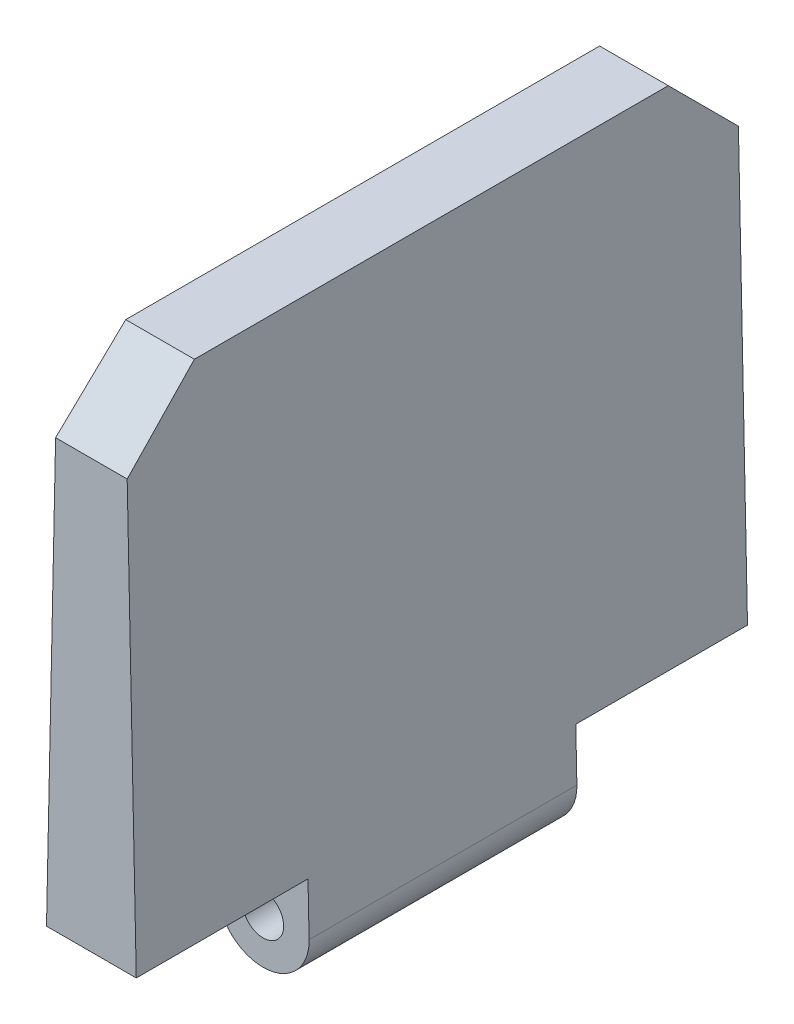
ISO-10303-21;
HEADER;
FILE_DESCRIPTION(('STEP AP214'),'2;1');
FILE_NAME('part.step','',(''),(''),'','','');
FILE_SCHEMA(('AUTOMOTIVE_DESIGN { 1 0 10303 214 1 1 1 1 }'));
ENDSEC;
DATA;
#1=APPLICATION_CONTEXT('core data for automotive mechanical design processes');
#2=APPLICATION_PROTOCOL_DEFINITION('international standard','automotive_design',2000,#1);
#3=PRODUCT_CONTEXT('',#1,'mechanical');
#4=PRODUCT('Part','Part','',(#3));
#5=PRODUCT_RELATED_PRODUCT_CATEGORY('part','',(#4));
#6=PRODUCT_DEFINITION_FORMATION('','',#4);
#7=PRODUCT_DEFINITION_CONTEXT('part definition',#1,'design');
#8=PRODUCT_DEFINITION('design','',#6,#7);
#9=PRODUCT_DEFINITION_SHAPE('','',#8);
#10=(LENGTH_UNIT() NAMED_UNIT(*) SI_UNIT(.MILLI.,.METRE.));
#11=(NAMED_UNIT(*) PLANE_ANGLE_UNIT() SI_UNIT($,.RADIAN.));
#12=(NAMED_UNIT(*) SI_UNIT($,.STERADIAN.) SOLID_ANGLE_UNIT());
#13=UNCERTAINTY_MEASURE_WITH_UNIT(LENGTH_MEASURE(1.E-05),#10,'distance_accuracy_value','');
#14=(GEOMETRIC_REPRESENTATION_CONTEXT(3) GLOBAL_UNCERTAINTY_ASSIGNED_CONTEXT((#13)) GLOBAL_UNIT_ASSIGNED_CONTEXT((#10,
#11,#12)) REPRESENTATION_CONTEXT('',''));
#15=CARTESIAN_POINT('',(0.,0.,0.));
#16=DIRECTION('',(0.,0.,1.));
#17=DIRECTION('',(1.,0.,0.));
#18=AXIS2_PLACEMENT_3D('',#15,#16,#17);
#19=CARTESIAN_POINT('',(1.27,20.32,-22.61));
#20=DIRECTION('',(0.,1.,0.));
#21=DIRECTION('',(0.,0.,1.));
#22=AXIS2_PLACEMENT_3D('',#19,#20,#21);
#23=PLANE('',#22);
#24=DIRECTION('',(0.,0.,1.));
#25=VECTOR('',#24,1.);
#26=CARTESIAN_POINT('',(1.27,20.32,-22.61));
#27=LINE('',#26,#25);
#28=CARTESIAN_POINT('',(1.27,20.32,-20.07));
#29=VERTEX_POINT('',#28);
#30=CARTESIAN_POINT('',(1.27,20.32,-2.53999999999999));
#31=VERTEX_POINT('',#30);
#32=EDGE_CURVE('E148',#29,#31,#27,.T.);
#33=ORIENTED_EDGE('',*,*,#32,.F.);
#34=DIRECTION('',(-1.,0.,0.));
#35=VECTOR('',#34,1.);
#36=CARTESIAN_POINT('',(-1.27,20.32,-20.07));
#37=LINE('',#36,#35);
#38=CARTESIAN_POINT('',(-1.27,20.32,-20.07));
#39=VERTEX_POINT('',#38);
#40=EDGE_CURVE('E156',#29,#39,#37,.T.);
#41=ORIENTED_EDGE('',*,*,#40,.T.);
#42=DIRECTION('',(0.,0.,1.));
#43=VECTOR('',#42,1.);
#44=CARTESIAN_POINT('',(-1.27,20.32,-22.61));
#45=LINE('',#44,#43);
#46=CARTESIAN_POINT('',(-1.27,20.32,-2.54000000000001));
#47=VERTEX_POINT('',#46);
#48=EDGE_CURVE('E134',#39,#47,#45,.T.);
#49=ORIENTED_EDGE('',*,*,#48,.T.);
#50=DIRECTION('',(1.,0.,0.));
#51=VECTOR('',#50,1.);
#52=CARTESIAN_POINT('',(1.27,20.32,-2.54000000000001));
#53=LINE('',#52,#51);
#54=EDGE_CURVE('E151',#47,#31,#53,.T.);
#55=ORIENTED_EDGE('',*,*,#54,.T.);
#56=EDGE_LOOP('',(#33,#41,#49,#55));
#57=FACE_BOUND('',#56,.T.);
#58=ADVANCED_FACE('F32',(#57),#23,.T.);
#59=CARTESIAN_POINT('',(1.70141521074878,0.0361872993282011,-22.61));
#60=DIRECTION('',(0.999773892789273,0.0212641317006701,0.));
#61=DIRECTION('',(-0.0212641317006701,0.999773892789273,0.));
#62=AXIS2_PLACEMENT_3D('',#59,#60,#61);
#63=PLANE('',#62);
#64=DIRECTION('',(0.0212641317006701,-0.999773892789273,0.));
#65=VECTOR('',#64,1.);
#66=CARTESIAN_POINT('',(1.70141521074878,0.0361872993281891,-16.258));
#67=LINE('',#66,#65);
#68=CARTESIAN_POINT('',(1.66043225101786,1.96307967212697,-16.258));
#69=VERTEX_POINT('',#68);
#70=CARTESIAN_POINT('',(1.70141521074878,0.036187299328201,-16.258));
#71=VERTEX_POINT('',#70);
#72=EDGE_CURVE('E127',#69,#71,#67,.T.);
#73=ORIENTED_EDGE('',*,*,#72,.F.);
#74=DIRECTION('',(0.,0.,1.));
#75=VECTOR('',#74,1.);
#76=CARTESIAN_POINT('',(1.66043225101786,1.96307967212697,-22.61));
#77=LINE('',#76,#75);
#78=CARTESIAN_POINT('',(1.66043225101786,1.96307967212697,-22.61));
#79=VERTEX_POINT('',#78);
#80=EDGE_CURVE('E113',#79,#69,#77,.T.);
#81=ORIENTED_EDGE('',*,*,#80,.F.);
#82=DIRECTION('',(-0.0212641317006701,0.999773892789273,0.));
#83=VECTOR('',#82,1.);
#84=CARTESIAN_POINT('',(1.70141521074878,0.0361872993282011,-22.61));
#85=LINE('',#84,#83);
#86=CARTESIAN_POINT('',(1.32402310953431,17.78,-22.61));
#87=VERTEX_POINT('',#86);
#88=EDGE_CURVE('E124',#79,#87,#85,.T.);
#89=ORIENTED_EDGE('',*,*,#88,.T.);
#90=DIRECTION('',(-0.0150377116930007,0.707026826657604,0.7070268266576));
#91=VECTOR('',#90,1.);
#92=CARTESIAN_POINT('',(1.51276183050272,8.90608742087959,-31.4839125791204));
#93=LINE('',#92,#91);
#94=EDGE_CURVE('E41',#87,#29,#93,.T.);
#95=ORIENTED_EDGE('',*,*,#94,.T.);
#96=ORIENTED_EDGE('',*,*,#32,.T.);
#97=DIRECTION('',(-0.0150377116930007,0.707026826657601,-0.707026826657604));
#98=VECTOR('',#97,1.);
#99=CARTESIAN_POINT('',(1.27237082777296,20.2085309898813,-2.42853098988135));
#100=LINE('',#99,#98);
#101=CARTESIAN_POINT('',(1.32402310953431,17.78,0.));
#102=VERTEX_POINT('',#101);
#103=EDGE_CURVE('E164',#31,#102,#100,.F.);
#104=ORIENTED_EDGE('',*,*,#103,.T.);
#105=DIRECTION('',(-0.0212641317006701,0.999773892789273,0.));
#106=VECTOR('',#105,1.);
#107=CARTESIAN_POINT('',(1.70141521074878,0.0361872993282011,0.));
#108=LINE('',#107,#106);
#109=CARTESIAN_POINT('',(1.66043225101786,1.96307967212697,0.));
#110=VERTEX_POINT('',#109);
#111=EDGE_CURVE('E140',#110,#102,#108,.T.);
#112=ORIENTED_EDGE('',*,*,#111,.F.);
#113=DIRECTION('',(0.,0.,1.));
#114=VECTOR('',#113,1.);
#115=CARTESIAN_POINT('',(1.66043225101786,1.96307967212697,-22.61));
#116=LINE('',#115,#114);
#117=CARTESIAN_POINT('',(1.66043225101786,1.96307967212697,-6.352));
#118=VERTEX_POINT('',#117);
#119=EDGE_CURVE('E57',#118,#110,#116,.T.);
#120=ORIENTED_EDGE('',*,*,#119,.F.);
#121=DIRECTION('',(-0.0212641317006701,0.999773892789273,0.));
#122=VECTOR('',#121,1.);
#123=CARTESIAN_POINT('',(1.70141521074878,0.0361872993282011,-6.352));
#124=LINE('',#123,#122);
#125=CARTESIAN_POINT('',(1.70141521074878,0.036187299328201,-6.352));
#126=VERTEX_POINT('',#125);
#127=EDGE_CURVE('E184',#126,#118,#124,.T.);
#128=ORIENTED_EDGE('',*,*,#127,.F.);
#129=DIRECTION('',(0.,0.,1.));
#130=VECTOR('',#129,1.);
#131=CARTESIAN_POINT('',(1.70141521074878,0.036187299328201,-22.61));
#132=LINE('',#131,#130);
#133=EDGE_CURVE('E152',#71,#126,#132,.T.);
#134=ORIENTED_EDGE('',*,*,#133,.F.);
#135=EDGE_LOOP('',(#73,#81,#89,#95,#96,#104,#112,#120,#128,#134));
#136=FACE_BOUND('',#135,.T.);
#137=ADVANCED_FACE('F123',(#136),#63,.T.);
#138=CARTESIAN_POINT('',(0.,0.,-22.61));
#139=DIRECTION('',(0.,0.,1.));
#140=DIRECTION('',(1.,0.,0.));
#141=AXIS2_PLACEMENT_3D('',#138,#139,#140);
#142=CYLINDRICAL_SURFACE('',#141,1.70179999999999);
#143=DIRECTION('',(0.,0.,1.));
#144=VECTOR('',#143,1.);
#145=CARTESIAN_POINT('',(-1.70141521074878,0.0361872993282011,-22.61));
#146=LINE('',#145,#144);
#147=CARTESIAN_POINT('',(-1.70141521074878,0.0361872993282011,-16.258));
#148=VERTEX_POINT('',#147);
#149=CARTESIAN_POINT('',(-1.70141521074878,0.0361872993282011,-6.352));
#150=VERTEX_POINT('',#149);
#151=EDGE_CURVE('E138',#148,#150,#146,.T.);
#152=ORIENTED_EDGE('',*,*,#151,.F.);
#153=CARTESIAN_POINT('',(0.,0.,-16.258));
#154=DIRECTION('',(0.,0.,1.));
#155=DIRECTION('',(0.,-1.,0.));
#156=AXIS2_PLACEMENT_3D('',#153,#154,#155);
#157=CIRCLE('',#156,1.70179999999999);
#158=EDGE_CURVE('E325',#71,#148,#157,.F.);
#159=ORIENTED_EDGE('',*,*,#158,.F.);
#160=ORIENTED_EDGE('',*,*,#133,.T.);
#161=CARTESIAN_POINT('',(0.,0.,-6.352));
#162=DIRECTION('',(0.,0.,-1.));
#163=DIRECTION('',(-1.,0.,0.));
#164=AXIS2_PLACEMENT_3D('',#161,#162,#163);
#165=CIRCLE('',#164,1.70179999999999);
#166=EDGE_CURVE('E174',#150,#126,#165,.F.);
#167=ORIENTED_EDGE('',*,*,#166,.F.);
#168=EDGE_LOOP('',(#152,#159,#160,#167));
#169=FACE_BOUND('',#168,.T.);
#170=ADVANCED_FACE('F204',(#169),#142,.T.);
#171=CARTESIAN_POINT('',(-1.27,20.32,-22.61));
#172=DIRECTION('',(-0.999773892789273,0.0212641317006701,0.));
#173=DIRECTION('',(-0.0212641317006701,-0.999773892789273,0.));
#174=AXIS2_PLACEMENT_3D('',#171,#172,#173);
#175=PLANE('',#174);
#176=DIRECTION('',(0.0212641317006701,0.999773892789273,0.));
#177=VECTOR('',#176,1.);
#178=CARTESIAN_POINT('',(-1.27,20.32,-16.258));
#179=LINE('',#178,#177);
#180=CARTESIAN_POINT('',(-1.66043225101786,1.96307967212697,-16.258));
#181=VERTEX_POINT('',#180);
#182=EDGE_CURVE('E201',#148,#181,#179,.T.);
#183=ORIENTED_EDGE('',*,*,#182,.F.);
#184=ORIENTED_EDGE('',*,*,#151,.T.);
#185=DIRECTION('',(-0.0212641317006701,-0.999773892789273,0.));
#186=VECTOR('',#185,1.);
#187=CARTESIAN_POINT('',(-1.27,20.32,-6.352));
#188=LINE('',#187,#186);
#189=CARTESIAN_POINT('',(-1.66043225101786,1.96307967212697,-6.352));
#190=VERTEX_POINT('',#189);
#191=EDGE_CURVE('E169',#190,#150,#188,.T.);
#192=ORIENTED_EDGE('',*,*,#191,.F.);
#193=DIRECTION('',(0.,0.,-1.));
#194=VECTOR('',#193,1.);
#195=CARTESIAN_POINT('',(-1.66043225101786,1.96307967212698,-22.61));
#196=LINE('',#195,#194);
#197=CARTESIAN_POINT('',(-1.66043225101786,1.96307967212697,0.));
#198=VERTEX_POINT('',#197);
#199=EDGE_CURVE('E186',#198,#190,#196,.T.);
#200=ORIENTED_EDGE('',*,*,#199,.F.);
#201=DIRECTION('',(-0.0212641317006701,-0.999773892789273,0.));
#202=VECTOR('',#201,1.);
#203=CARTESIAN_POINT('',(-1.27,20.32,0.));
#204=LINE('',#203,#202);
#205=CARTESIAN_POINT('',(-1.32402310953431,17.78,0.));
#206=VERTEX_POINT('',#205);
#207=EDGE_CURVE('E144',#206,#198,#204,.T.);
#208=ORIENTED_EDGE('',*,*,#207,.F.);
#209=DIRECTION('',(-0.0150377116930007,-0.707026826657601,0.707026826657604));
#210=VECTOR('',#209,1.);
#211=CARTESIAN_POINT('',(-1.05661444383962,30.3527307576233,-12.5727307576234));
#212=LINE('',#211,#210);
#213=EDGE_CURVE('E159',#206,#47,#212,.F.);
#214=ORIENTED_EDGE('',*,*,#213,.T.);
#215=ORIENTED_EDGE('',*,*,#48,.F.);
#216=DIRECTION('',(-0.0150377116930007,-0.707026826657604,-0.7070268266576));
#217=VECTOR('',#216,1.);
#218=CARTESIAN_POINT('',(-1.29700544656938,19.0502871886217,-21.3397128113783));
#219=LINE('',#218,#217);
#220=CARTESIAN_POINT('',(-1.32402310953431,17.78,-22.61));
#221=VERTEX_POINT('',#220);
#222=EDGE_CURVE('E161',#39,#221,#219,.T.);
#223=ORIENTED_EDGE('',*,*,#222,.T.);
#224=DIRECTION('',(-0.0212641317006701,-0.999773892789273,0.));
#225=VECTOR('',#224,1.);
#226=CARTESIAN_POINT('',(-1.27,20.32,-22.61));
#227=LINE('',#226,#225);
#228=CARTESIAN_POINT('',(-1.66043225101786,1.96307967212697,-22.61));
#229=VERTEX_POINT('',#228);
#230=EDGE_CURVE('E135',#221,#229,#227,.T.);
#231=ORIENTED_EDGE('',*,*,#230,.T.);
#232=DIRECTION('',(0.,0.,-1.));
#233=VECTOR('',#232,1.);
#234=CARTESIAN_POINT('',(-1.66043225101786,1.96307967212697,-22.61));
#235=LINE('',#234,#233);
#236=EDGE_CURVE('E49',#181,#229,#235,.T.);
#237=ORIENTED_EDGE('',*,*,#236,.F.);
#238=EDGE_LOOP('',(#183,#184,#192,#200,#208,#214,#215,#223,#231,#237));
#239=FACE_BOUND('',#238,.T.);
#240=ADVANCED_FACE('F198',(#239),#175,.T.);
#241=CARTESIAN_POINT('',(0.,0.,-22.61));
#242=DIRECTION('',(0.,0.,1.));
#243=DIRECTION('',(1.,0.,0.));
#244=AXIS2_PLACEMENT_3D('',#241,#242,#243);
#245=PLANE('',#244);
#246=ORIENTED_EDGE('',*,*,#88,.F.);
#247=DIRECTION('',(1.,0.,0.));
#248=VECTOR('',#247,1.);
#249=CARTESIAN_POINT('',(-1.70179999999999,1.96307967212697,-22.61));
#250=LINE('',#249,#248);
#251=EDGE_CURVE('E110',#229,#79,#250,.T.);
#252=ORIENTED_EDGE('',*,*,#251,.F.);
#253=ORIENTED_EDGE('',*,*,#230,.F.);
#254=DIRECTION('',(1.,0.,0.));
#255=VECTOR('',#254,1.);
#256=CARTESIAN_POINT('',(1.27,17.78,-22.61));
#257=LINE('',#256,#255);
#258=EDGE_CURVE('E132',#221,#87,#257,.T.);
#259=ORIENTED_EDGE('',*,*,#258,.T.);
#260=EDGE_LOOP('',(#246,#252,#253,#259));
#261=FACE_BOUND('',#260,.T.);
#262=ADVANCED_FACE('F130',(#261),#245,.F.);
#263=CARTESIAN_POINT('',(0.,0.,0.));
#264=DIRECTION('',(0.,0.,1.));
#265=DIRECTION('',(1.,0.,0.));
#266=AXIS2_PLACEMENT_3D('',#263,#264,#265);
#267=PLANE('',#266);
#268=DIRECTION('',(1.,0.,0.));
#269=VECTOR('',#268,1.);
#270=CARTESIAN_POINT('',(-1.70179999999999,1.96307967212697,0.));
#271=LINE('',#270,#269);
#272=EDGE_CURVE('E170',#198,#110,#271,.T.);
#273=ORIENTED_EDGE('',*,*,#272,.T.);
#274=ORIENTED_EDGE('',*,*,#111,.T.);
#275=DIRECTION('',(-1.,0.,0.));
#276=VECTOR('',#275,1.);
#277=CARTESIAN_POINT('',(0.,17.78,0.));
#278=LINE('',#277,#276);
#279=EDGE_CURVE('E11',#102,#206,#278,.T.);
#280=ORIENTED_EDGE('',*,*,#279,.T.);
#281=ORIENTED_EDGE('',*,*,#207,.T.);
#282=EDGE_LOOP('',(#273,#274,#280,#281));
#283=FACE_BOUND('',#282,.T.);
#284=ADVANCED_FACE('F207',(#283),#267,.T.);
#285=CARTESIAN_POINT('',(1.27,20.32,-20.07));
#286=DIRECTION('',(0.,0.707106781186546,-0.70710678118655));
#287=DIRECTION('',(0.,0.70710678118655,0.707106781186546));
#288=AXIS2_PLACEMENT_3D('',#285,#286,#287);
#289=PLANE('',#288);
#290=ORIENTED_EDGE('',*,*,#94,.F.);
#291=ORIENTED_EDGE('',*,*,#258,.F.);
#292=ORIENTED_EDGE('',*,*,#222,.F.);
#293=ORIENTED_EDGE('',*,*,#40,.F.);
#294=EDGE_LOOP('',(#290,#291,#292,#293));
#295=FACE_BOUND('',#294,.T.);
#296=ADVANCED_FACE('F216',(#295),#289,.T.);
#297=CARTESIAN_POINT('',(0.,17.78,0.));
#298=DIRECTION('',(0.,-0.707106781186549,-0.707106781186546));
#299=DIRECTION('',(0.,0.707106781186546,-0.707106781186549));
#300=AXIS2_PLACEMENT_3D('',#297,#298,#299);
#301=PLANE('',#300);
#302=ORIENTED_EDGE('',*,*,#103,.F.);
#303=ORIENTED_EDGE('',*,*,#54,.F.);
#304=ORIENTED_EDGE('',*,*,#213,.F.);
#305=ORIENTED_EDGE('',*,*,#279,.F.);
#306=EDGE_LOOP('',(#302,#303,#304,#305));
#307=FACE_BOUND('',#306,.T.);
#308=ADVANCED_FACE('F34',(#307),#301,.F.);
#309=CARTESIAN_POINT('',(0.,0.,-22.61));
#310=DIRECTION('',(0.,0.,1.));
#311=DIRECTION('',(1.,0.,0.));
#312=AXIS2_PLACEMENT_3D('',#309,#310,#311);
#313=CYLINDRICAL_SURFACE('',#312,0.759999999999995);
#314=CARTESIAN_POINT('',(0.,0.,-16.258));
#315=DIRECTION('',(0.,0.,1.));
#316=DIRECTION('',(0.,-1.,0.));
#317=AXIS2_PLACEMENT_3D('',#314,#315,#316);
#318=CIRCLE('',#317,0.759999999999995);
#319=CARTESIAN_POINT('',(0.759999999999995,0.,-16.258));
#320=VERTEX_POINT('',#319);
#321=EDGE_CURVE('E36',#320,#320,#318,.F.);
#322=CARTESIAN_POINT('',(0.,0.,-6.352));
#323=DIRECTION('',(0.,0.,-1.));
#324=DIRECTION('',(-1.,0.,0.));
#325=AXIS2_PLACEMENT_3D('',#322,#323,#324);
#326=CIRCLE('',#325,0.759999999999995);
#327=CARTESIAN_POINT('',(0.759999999999995,0.,-6.352));
#328=VERTEX_POINT('',#327);
#329=EDGE_CURVE('E167',#328,#328,#326,.F.);
#330=CARTESIAN_POINT('',(0.759999999999995,0.,-16.258));
#331=CARTESIAN_POINT('',(0.759999999999995,0.,-16.1548125));
#332=CARTESIAN_POINT('',(0.759999999999995,0.,-16.051625));
#333=CARTESIAN_POINT('',(0.759999999999995,0.,-15.84525));
#334=CARTESIAN_POINT('',(0.759999999999995,0.,-15.7420625));
#335=CARTESIAN_POINT('',(0.759999999999995,0.,-15.5356875));
#336=CARTESIAN_POINT('',(0.759999999999995,0.,-15.4325));
#337=CARTESIAN_POINT('',(0.759999999999995,0.,-15.226125));
#338=CARTESIAN_POINT('',(0.759999999999995,0.,-15.1229375));
#339=CARTESIAN_POINT('',(0.759999999999995,0.,-14.9165625));
#340=CARTESIAN_POINT('',(0.759999999999995,0.,-14.813375));
#341=CARTESIAN_POINT('',(0.759999999999995,0.,-14.607));
#342=CARTESIAN_POINT('',(0.759999999999995,0.,-14.5038125));
#343=CARTESIAN_POINT('',(0.759999999999995,0.,-14.2974375));
#344=CARTESIAN_POINT('',(0.759999999999995,0.,-14.19425));
#345=CARTESIAN_POINT('',(0.759999999999995,0.,-13.987875));
#346=CARTESIAN_POINT('',(0.759999999999995,0.,-13.8846875));
#347=CARTESIAN_POINT('',(0.759999999999995,0.,-13.6783125));
#348=CARTESIAN_POINT('',(0.759999999999995,0.,-13.575125));
#349=CARTESIAN_POINT('',(0.759999999999995,0.,-13.36875));
#350=CARTESIAN_POINT('',(0.759999999999995,0.,-13.2655625));
#351=CARTESIAN_POINT('',(0.759999999999995,0.,-13.0591875));
#352=CARTESIAN_POINT('',(0.759999999999995,0.,-12.956));
#353=CARTESIAN_POINT('',(0.759999999999995,0.,-12.749625));
#354=CARTESIAN_POINT('',(0.759999999999995,0.,-12.6464375));
#355=CARTESIAN_POINT('',(0.759999999999995,0.,-12.4400625));
#356=CARTESIAN_POINT('',(0.759999999999995,0.,-12.336875));
#357=CARTESIAN_POINT('',(0.759999999999995,0.,-12.1305));
#358=CARTESIAN_POINT('',(0.759999999999995,0.,-12.0273125));
#359=CARTESIAN_POINT('',(0.759999999999995,0.,-11.8209375));
#360=CARTESIAN_POINT('',(0.759999999999995,0.,-11.71775));
#361=CARTESIAN_POINT('',(0.759999999999995,0.,-11.511375));
#362=CARTESIAN_POINT('',(0.759999999999995,0.,-11.4081875));
#363=CARTESIAN_POINT('',(0.759999999999995,0.,-11.2018125));
#364=CARTESIAN_POINT('',(0.759999999999995,0.,-11.098625));
#365=CARTESIAN_POINT('',(0.759999999999995,0.,-10.89225));
#366=CARTESIAN_POINT('',(0.759999999999995,0.,-10.7890625));
#367=CARTESIAN_POINT('',(0.759999999999995,0.,-10.5826875));
#368=CARTESIAN_POINT('',(0.759999999999995,0.,-10.4795));
#369=CARTESIAN_POINT('',(0.759999999999995,0.,-10.273125));
#370=CARTESIAN_POINT('',(0.759999999999995,0.,-10.1699375));
#371=CARTESIAN_POINT('',(0.759999999999995,0.,-9.9635625));
#372=CARTESIAN_POINT('',(0.759999999999995,0.,-9.860375));
#373=CARTESIAN_POINT('',(0.759999999999995,0.,-9.654));
#374=CARTESIAN_POINT('',(0.759999999999995,0.,-9.5508125));
#375=CARTESIAN_POINT('',(0.759999999999995,0.,-9.3444375));
#376=CARTESIAN_POINT('',(0.759999999999995,0.,-9.24125));
#377=CARTESIAN_POINT('',(0.759999999999995,0.,-9.034875));
#378=CARTESIAN_POINT('',(0.759999999999995,0.,-8.9316875));
#379=CARTESIAN_POINT('',(0.759999999999995,0.,-8.7253125));
#380=CARTESIAN_POINT('',(0.759999999999995,0.,-8.622125));
#381=CARTESIAN_POINT('',(0.759999999999995,0.,-8.41575));
#382=CARTESIAN_POINT('',(0.759999999999995,0.,-8.3125625));
#383=CARTESIAN_POINT('',(0.759999999999995,0.,-8.1061875));
#384=CARTESIAN_POINT('',(0.759999999999995,0.,-8.003));
#385=CARTESIAN_POINT('',(0.759999999999995,0.,-7.796625));
#386=CARTESIAN_POINT('',(0.759999999999995,0.,-7.6934375));
#387=CARTESIAN_POINT('',(0.759999999999995,0.,-7.4870625));
#388=CARTESIAN_POINT('',(0.759999999999995,0.,-7.383875));
#389=CARTESIAN_POINT('',(0.759999999999995,0.,-7.1775));
#390=CARTESIAN_POINT('',(0.759999999999995,0.,-7.0743125));
#391=CARTESIAN_POINT('',(0.759999999999995,0.,-6.86793749999999));
#392=CARTESIAN_POINT('',(0.759999999999995,0.,-6.76475));
#393=CARTESIAN_POINT('',(0.759999999999995,0.,-6.558375));
#394=CARTESIAN_POINT('',(0.759999999999995,0.,-6.4551875));
#395=CARTESIAN_POINT('',(0.759999999999995,0.,-6.352));
#396=B_SPLINE_CURVE_WITH_KNOTS('',3,(#330,#331,#332,#333,#334,#335,#336,#337,#338,#339,#340,
#341,#342,#343,#344,#345,#346,#347,#348,#349,#350,#351,#352,#353,#354,#355,#356,#357,#358,#359,
#360,#361,#362,#363,#364,#365,#366,#367,#368,#369,#370,#371,#372,#373,#374,#375,#376,#377,#378,
#379,#380,#381,#382,#383,#384,#385,#386,#387,#388,#389,#390,#391,#392,#393,#394,#395),
.UNSPECIFIED.,.F.,.F.,(4,2,2,2,2,2,2,2,2,2,2,2,2,2,2,2,2,2,2,2,2,2,2,2,2,2,2,2,2,2,2,2,4),(0.,
0.309562500000003,0.619125000000002,0.928687500000002,1.23825,1.5478125,1.857375,2.1669375,
2.4765,2.7860625,3.095625,3.4051875,3.71475,4.0243125,4.333875,4.6434375,4.953,5.2625625,
5.572125,5.8816875,6.19125,6.5008125,6.810375,7.1199375,7.4295,7.7390625,8.048625,8.3581875,
8.66775000000001,8.9773125,9.28687500000001,9.59643750000001,9.90600000000001),.UNSPECIFIED.);
#397=EDGE_CURVE('BSEAM215',#320,#328,#396,.T.);
#398=ORIENTED_EDGE('',*,*,#321,.T.);
#399=ORIENTED_EDGE('',*,*,#329,.T.);
#400=ORIENTED_EDGE('',*,*,#397,.T.);
#401=ORIENTED_EDGE('',*,*,#397,.F.);
#402=EDGE_LOOP('',(#398,#400,#399,#401));
#403=FACE_BOUND('',#402,.T.);
#404=ADVANCED_FACE('F215',(#403),#313,.F.);
#405=CARTESIAN_POINT('',(-1.70179999999999,-1.70179999999999,-6.352));
#406=DIRECTION('',(0.,0.,-1.));
#407=DIRECTION('',(-1.,0.,0.));
#408=AXIS2_PLACEMENT_3D('',#405,#406,#407);
#409=PLANE('',#408);
#410=ORIENTED_EDGE('',*,*,#127,.T.);
#411=DIRECTION('',(1.,0.,0.));
#412=VECTOR('',#411,1.);
#413=CARTESIAN_POINT('',(-1.70179999999999,1.96307967212697,-6.352));
#414=LINE('',#413,#412);
#415=EDGE_CURVE('E128',#190,#118,#414,.T.);
#416=ORIENTED_EDGE('',*,*,#415,.F.);
#417=ORIENTED_EDGE('',*,*,#191,.T.);
#418=ORIENTED_EDGE('',*,*,#166,.T.);
#419=EDGE_LOOP('',(#410,#416,#417,#418));
#420=FACE_BOUND('',#419,.T.);
#421=ORIENTED_EDGE('',*,*,#329,.F.);
#422=EDGE_LOOP('',(#421));
#423=FACE_BOUND('',#422,.T.);
#424=ADVANCED_FACE('F194',(#420,#423),#409,.F.);
#425=CARTESIAN_POINT('',(-1.70179999999999,1.96307967212697,-6.352));
#426=DIRECTION('',(0.,1.,0.));
#427=DIRECTION('',(0.,0.,1.));
#428=AXIS2_PLACEMENT_3D('',#425,#426,#427);
#429=PLANE('',#428);
#430=ORIENTED_EDGE('',*,*,#119,.T.);
#431=ORIENTED_EDGE('',*,*,#272,.F.);
#432=ORIENTED_EDGE('',*,*,#199,.T.);
#433=ORIENTED_EDGE('',*,*,#415,.T.);
#434=EDGE_LOOP('',(#430,#431,#432,#433));
#435=FACE_BOUND('',#434,.T.);
#436=ADVANCED_FACE('F189',(#435),#429,.F.);
#437=CARTESIAN_POINT('',(-1.70179999999999,-1.70179999999999,-16.258));
#438=DIRECTION('',(0.,0.,1.));
#439=DIRECTION('',(0.,-1.,0.));
#440=AXIS2_PLACEMENT_3D('',#437,#438,#439);
#441=PLANE('',#440);
#442=ORIENTED_EDGE('',*,*,#72,.T.);
#443=ORIENTED_EDGE('',*,*,#158,.T.);
#444=ORIENTED_EDGE('',*,*,#182,.T.);
#445=DIRECTION('',(1.,0.,0.));
#446=VECTOR('',#445,1.);
#447=CARTESIAN_POINT('',(-1.70179999999999,1.96307967212697,-16.258));
#448=LINE('',#447,#446);
#449=EDGE_CURVE('E119',#181,#69,#448,.T.);
#450=ORIENTED_EDGE('',*,*,#449,.T.);
#451=EDGE_LOOP('',(#442,#443,#444,#450));
#452=FACE_BOUND('',#451,.T.);
#453=ORIENTED_EDGE('',*,*,#321,.F.);
#454=EDGE_LOOP('',(#453));
#455=FACE_BOUND('',#454,.T.);
#456=ADVANCED_FACE('F243',(#452,#455),#441,.F.);
#457=CARTESIAN_POINT('',(-1.70179999999999,1.96307967212697,-16.258));
#458=DIRECTION('',(0.,1.,0.));
#459=DIRECTION('',(0.,0.,1.));
#460=AXIS2_PLACEMENT_3D('',#457,#458,#459);
#461=PLANE('',#460);
#462=ORIENTED_EDGE('',*,*,#80,.T.);
#463=ORIENTED_EDGE('',*,*,#449,.F.);
#464=ORIENTED_EDGE('',*,*,#236,.T.);
#465=ORIENTED_EDGE('',*,*,#251,.T.);
#466=EDGE_LOOP('',(#462,#463,#464,#465));
#467=FACE_BOUND('',#466,.T.);
#468=ADVANCED_FACE('F112',(#467),#461,.F.);
#469=CLOSED_SHELL('',(#58,#137,#170,#240,#262,#284,#296,#308,#404,#424,#436,#456,#468));
#470=MANIFOLD_SOLID_BREP('B2',#469);
#471=ADVANCED_BREP_SHAPE_REPRESENTATION('',(#18,#470),#14);
#472=SHAPE_DEFINITION_REPRESENTATION(#9,#471);
ENDSEC;
END-ISO-10303-21;
